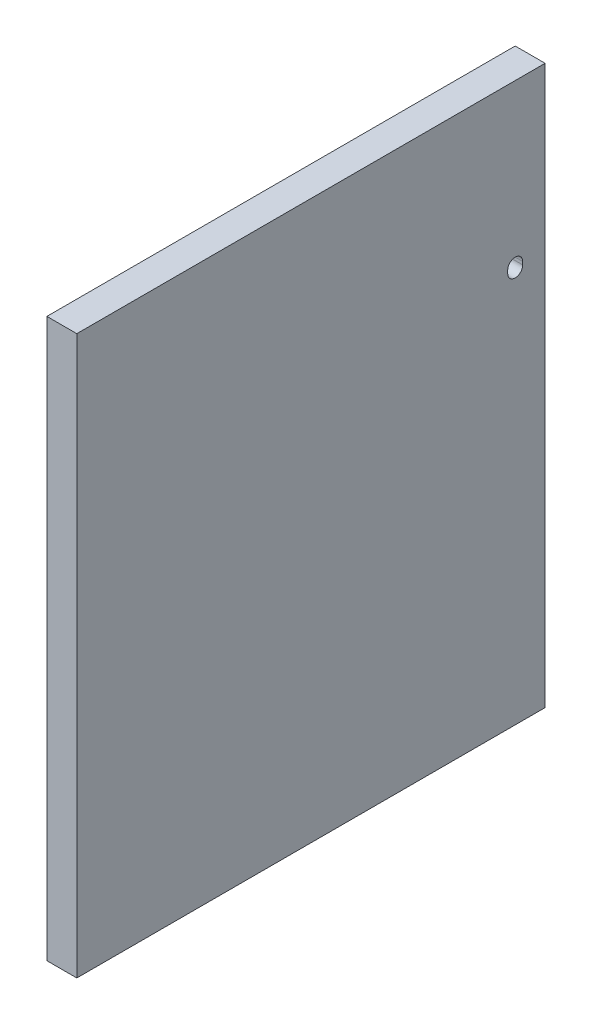
ISO-10303-21;
HEADER;
FILE_DESCRIPTION(('STEP AP214'),'2;1');
FILE_NAME('part.step','',(''),(''),'','','');
FILE_SCHEMA(('AUTOMOTIVE_DESIGN { 1 0 10303 214 1 1 1 1 }'));
ENDSEC;
DATA;
#1=APPLICATION_CONTEXT('core data for automotive mechanical design processes');
#2=APPLICATION_PROTOCOL_DEFINITION('international standard','automotive_design',2000,#1);
#3=PRODUCT_CONTEXT('',#1,'mechanical');
#4=PRODUCT('Part','Part','',(#3));
#5=PRODUCT_RELATED_PRODUCT_CATEGORY('part','',(#4));
#6=PRODUCT_DEFINITION_FORMATION('','',#4);
#7=PRODUCT_DEFINITION_CONTEXT('part definition',#1,'design');
#8=PRODUCT_DEFINITION('design','',#6,#7);
#9=PRODUCT_DEFINITION_SHAPE('','',#8);
#10=(LENGTH_UNIT() NAMED_UNIT(*) SI_UNIT(.MILLI.,.METRE.));
#11=(NAMED_UNIT(*) PLANE_ANGLE_UNIT() SI_UNIT($,.RADIAN.));
#12=(NAMED_UNIT(*) SI_UNIT($,.STERADIAN.) SOLID_ANGLE_UNIT());
#13=UNCERTAINTY_MEASURE_WITH_UNIT(LENGTH_MEASURE(1.E-05),#10,'distance_accuracy_value','');
#14=(GEOMETRIC_REPRESENTATION_CONTEXT(3) GLOBAL_UNCERTAINTY_ASSIGNED_CONTEXT((#13)) GLOBAL_UNIT_ASSIGNED_CONTEXT((#10,
#11,#12)) REPRESENTATION_CONTEXT('',''));
#15=CARTESIAN_POINT('',(0.,0.,0.));
#16=DIRECTION('',(0.,0.,1.));
#17=DIRECTION('',(1.,0.,0.));
#18=AXIS2_PLACEMENT_3D('',#15,#16,#17);
#19=CARTESIAN_POINT('',(12.7,68.7232885793492,-49.1565136701883));
#20=DIRECTION('',(0.,0.,1.));
#21=DIRECTION('',(0.,-1.,0.));
#22=AXIS2_PLACEMENT_3D('',#19,#20,#21);
#23=PLANE('',#22);
#24=DIRECTION('',(0.,1.,0.));
#25=VECTOR('',#24,1.);
#26=CARTESIAN_POINT('',(0.,68.7232885793492,-49.1565136701883));
#27=LINE('',#26,#25);
#28=CARTESIAN_POINT('',(0.,-168.110077071333,-49.1565136701883));
#29=VERTEX_POINT('',#28);
#30=CARTESIAN_POINT('',(0.,68.7232885793492,-49.1565136701883));
#31=VERTEX_POINT('',#30);
#32=EDGE_CURVE('E143',#29,#31,#27,.T.);
#33=ORIENTED_EDGE('',*,*,#32,.T.);
#34=DIRECTION('',(-1.,0.,0.));
#35=VECTOR('',#34,1.);
#36=CARTESIAN_POINT('',(12.7,68.7232885793492,-49.1565136701883));
#37=LINE('',#36,#35);
#38=CARTESIAN_POINT('',(12.7,68.7232885793492,-49.1565136701883));
#39=VERTEX_POINT('',#38);
#40=EDGE_CURVE('E174',#39,#31,#37,.T.);
#41=ORIENTED_EDGE('',*,*,#40,.F.);
#42=DIRECTION('',(0.,1.,0.));
#43=VECTOR('',#42,1.);
#44=CARTESIAN_POINT('',(12.7,68.7232885793492,-49.1565136701883));
#45=LINE('',#44,#43);
#46=CARTESIAN_POINT('',(12.7,-168.110077071333,-49.1565136701883));
#47=VERTEX_POINT('',#46);
#48=EDGE_CURVE('E148',#47,#39,#45,.T.);
#49=ORIENTED_EDGE('',*,*,#48,.F.);
#50=DIRECTION('',(-1.,0.,0.));
#51=VECTOR('',#50,1.);
#52=CARTESIAN_POINT('',(12.7,-168.110077071333,-49.1565136701883));
#53=LINE('',#52,#51);
#54=EDGE_CURVE('E158',#47,#29,#53,.T.);
#55=ORIENTED_EDGE('',*,*,#54,.T.);
#56=EDGE_LOOP('',(#33,#41,#49,#55));
#57=FACE_BOUND('',#56,.T.);
#58=ADVANCED_FACE('F40',(#57),#23,.F.);
#59=CARTESIAN_POINT('',(12.7,68.7232885793492,149.604495714321));
#60=DIRECTION('',(0.,-1.,0.));
#61=DIRECTION('',(0.,0.,-1.));
#62=AXIS2_PLACEMENT_3D('',#59,#60,#61);
#63=PLANE('',#62);
#64=DIRECTION('',(0.,0.,1.));
#65=VECTOR('',#64,1.);
#66=CARTESIAN_POINT('',(0.,68.7232885793492,149.604495714321));
#67=LINE('',#66,#65);
#68=CARTESIAN_POINT('',(0.,68.7232885793492,149.604495714321));
#69=VERTEX_POINT('',#68);
#70=EDGE_CURVE('E161',#31,#69,#67,.T.);
#71=ORIENTED_EDGE('',*,*,#70,.T.);
#72=DIRECTION('',(-1.,0.,0.));
#73=VECTOR('',#72,1.);
#74=CARTESIAN_POINT('',(12.7,68.7232885793492,149.604495714321));
#75=LINE('',#74,#73);
#76=CARTESIAN_POINT('',(12.7,68.7232885793492,149.604495714321));
#77=VERTEX_POINT('',#76);
#78=EDGE_CURVE('E171',#77,#69,#75,.T.);
#79=ORIENTED_EDGE('',*,*,#78,.F.);
#80=DIRECTION('',(0.,0.,1.));
#81=VECTOR('',#80,1.);
#82=CARTESIAN_POINT('',(12.7,68.7232885793492,149.604495714321));
#83=LINE('',#82,#81);
#84=EDGE_CURVE('E151',#39,#77,#83,.T.);
#85=ORIENTED_EDGE('',*,*,#84,.F.);
#86=ORIENTED_EDGE('',*,*,#40,.T.);
#87=EDGE_LOOP('',(#71,#79,#85,#86));
#88=FACE_BOUND('',#87,.T.);
#89=ADVANCED_FACE('F238',(#88),#63,.F.);
#90=CARTESIAN_POINT('',(12.7,68.7232885793492,149.604495714321));
#91=DIRECTION('',(0.,0.,-1.));
#92=DIRECTION('',(0.,1.,0.));
#93=AXIS2_PLACEMENT_3D('',#90,#91,#92);
#94=PLANE('',#93);
#95=DIRECTION('',(0.,-1.,0.));
#96=VECTOR('',#95,1.);
#97=CARTESIAN_POINT('',(0.,68.7232885793492,149.604495714321));
#98=LINE('',#97,#96);
#99=CARTESIAN_POINT('',(0.,-168.110077071333,149.604495714321));
#100=VERTEX_POINT('',#99);
#101=EDGE_CURVE('E163',#69,#100,#98,.T.);
#102=ORIENTED_EDGE('',*,*,#101,.T.);
#103=DIRECTION('',(-1.,0.,0.));
#104=VECTOR('',#103,1.);
#105=CARTESIAN_POINT('',(12.7,-168.110077071333,149.604495714321));
#106=LINE('',#105,#104);
#107=CARTESIAN_POINT('',(12.7,-168.110077071333,149.604495714321));
#108=VERTEX_POINT('',#107);
#109=EDGE_CURVE('E168',#108,#100,#106,.T.);
#110=ORIENTED_EDGE('',*,*,#109,.F.);
#111=DIRECTION('',(0.,-1.,0.));
#112=VECTOR('',#111,1.);
#113=CARTESIAN_POINT('',(12.7,68.7232885793492,149.604495714321));
#114=LINE('',#113,#112);
#115=EDGE_CURVE('E154',#77,#108,#114,.T.);
#116=ORIENTED_EDGE('',*,*,#115,.F.);
#117=ORIENTED_EDGE('',*,*,#78,.T.);
#118=EDGE_LOOP('',(#102,#110,#116,#117));
#119=FACE_BOUND('',#118,.T.);
#120=ADVANCED_FACE('F235',(#119),#94,.F.);
#121=CARTESIAN_POINT('',(12.7,-168.110077071333,149.604495714321));
#122=DIRECTION('',(0.,1.,0.));
#123=DIRECTION('',(0.,0.,1.));
#124=AXIS2_PLACEMENT_3D('',#121,#122,#123);
#125=PLANE('',#124);
#126=DIRECTION('',(0.,0.,-1.));
#127=VECTOR('',#126,1.);
#128=CARTESIAN_POINT('',(0.,-168.110077071333,149.604495714321));
#129=LINE('',#128,#127);
#130=EDGE_CURVE('E152',#100,#29,#129,.T.);
#131=ORIENTED_EDGE('',*,*,#130,.T.);
#132=ORIENTED_EDGE('',*,*,#54,.F.);
#133=DIRECTION('',(0.,0.,-1.));
#134=VECTOR('',#133,1.);
#135=CARTESIAN_POINT('',(12.7,-168.110077071333,149.604495714321));
#136=LINE('',#135,#134);
#137=EDGE_CURVE('E156',#108,#47,#136,.T.);
#138=ORIENTED_EDGE('',*,*,#137,.F.);
#139=ORIENTED_EDGE('',*,*,#109,.T.);
#140=EDGE_LOOP('',(#131,#132,#138,#139));
#141=FACE_BOUND('',#140,.T.);
#142=ADVANCED_FACE('F231',(#141),#125,.F.);
#143=CARTESIAN_POINT('',(12.7,0.,0.));
#144=DIRECTION('',(1.,0.,0.));
#145=DIRECTION('',(0.,0.,-1.));
#146=AXIS2_PLACEMENT_3D('',#143,#144,#145);
#147=PLANE('',#146);
#148=CARTESIAN_POINT('',(12.7,0.635000000000001,-36.4565136701883));
#149=DIRECTION('',(-1.,0.,0.));
#150=DIRECTION('',(0.,0.,1.));
#151=AXIS2_PLACEMENT_3D('',#148,#149,#150);
#152=CIRCLE('',#151,3.17500000000001);
#153=CARTESIAN_POINT('',(12.7,0.635000000000002,-33.2815136701883));
#154=VERTEX_POINT('',#153);
#155=CARTESIAN_POINT('',(12.7,0.635000000000002,-39.6315136701883));
#156=VERTEX_POINT('',#155);
#157=EDGE_CURVE('E120',#154,#156,#152,.T.);
#158=ORIENTED_EDGE('',*,*,#157,.T.);
#159=DIRECTION('',(0.,-1.,0.));
#160=VECTOR('',#159,1.);
#161=CARTESIAN_POINT('',(12.7,0.635000000000002,-39.6315136701883));
#162=LINE('',#161,#160);
#163=CARTESIAN_POINT('',(12.7,-0.635000000000001,-39.6315136701883));
#164=VERTEX_POINT('',#163);
#165=EDGE_CURVE('E126',#156,#164,#162,.T.);
#166=ORIENTED_EDGE('',*,*,#165,.T.);
#167=CARTESIAN_POINT('',(12.7,-0.635000000000001,-36.4565136701883));
#168=DIRECTION('',(-1.,0.,0.));
#169=DIRECTION('',(0.,0.,1.));
#170=AXIS2_PLACEMENT_3D('',#167,#168,#169);
#171=CIRCLE('',#170,3.17500000000001);
#172=CARTESIAN_POINT('',(12.7,-0.635000000000002,-33.2815136701883));
#173=VERTEX_POINT('',#172);
#174=EDGE_CURVE('E130',#164,#173,#171,.T.);
#175=ORIENTED_EDGE('',*,*,#174,.T.);
#176=DIRECTION('',(0.,1.,0.));
#177=VECTOR('',#176,1.);
#178=CARTESIAN_POINT('',(12.7,0.635000000000002,-33.2815136701883));
#179=LINE('',#178,#177);
#180=EDGE_CURVE('E123',#173,#154,#179,.T.);
#181=ORIENTED_EDGE('',*,*,#180,.T.);
#182=EDGE_LOOP('',(#158,#166,#175,#181));
#183=FACE_BOUND('',#182,.T.);
#184=ORIENTED_EDGE('',*,*,#48,.T.);
#185=ORIENTED_EDGE('',*,*,#84,.T.);
#186=ORIENTED_EDGE('',*,*,#115,.T.);
#187=ORIENTED_EDGE('',*,*,#137,.T.);
#188=EDGE_LOOP('',(#184,#185,#186,#187));
#189=FACE_BOUND('',#188,.T.);
#190=ADVANCED_FACE('F132',(#183,#189),#147,.T.);
#191=CARTESIAN_POINT('',(0.,0.,0.));
#192=DIRECTION('',(1.,0.,0.));
#193=DIRECTION('',(0.,0.,-1.));
#194=AXIS2_PLACEMENT_3D('',#191,#192,#193);
#195=PLANE('',#194);
#196=CARTESIAN_POINT('',(0.,0.635000000000001,-36.4565136701883));
#197=DIRECTION('',(1.,0.,0.));
#198=DIRECTION('',(0.,0.,-1.));
#199=AXIS2_PLACEMENT_3D('',#196,#197,#198);
#200=CIRCLE('',#199,6.17500000000001);
#201=CARTESIAN_POINT('',(0.,0.635000000000002,-42.6315136701883));
#202=VERTEX_POINT('',#201);
#203=CARTESIAN_POINT('',(0.,0.635000000000002,-30.2815136701883));
#204=VERTEX_POINT('',#203);
#205=EDGE_CURVE('E180',#202,#204,#200,.T.);
#206=ORIENTED_EDGE('',*,*,#205,.T.);
#207=DIRECTION('',(0.,1.,0.));
#208=VECTOR('',#207,1.);
#209=CARTESIAN_POINT('',(0.,0.,-30.2815136701883));
#210=LINE('',#209,#208);
#211=CARTESIAN_POINT('',(0.,-0.635000000000002,-30.2815136701883));
#212=VERTEX_POINT('',#211);
#213=EDGE_CURVE('E186',#204,#212,#210,.F.);
#214=ORIENTED_EDGE('',*,*,#213,.T.);
#215=CARTESIAN_POINT('',(0.,-0.635000000000001,-36.4565136701883));
#216=DIRECTION('',(1.,0.,0.));
#217=DIRECTION('',(0.,0.,-1.));
#218=AXIS2_PLACEMENT_3D('',#215,#216,#217);
#219=CIRCLE('',#218,6.17500000000001);
#220=CARTESIAN_POINT('',(0.,-0.635,-42.6315136701883));
#221=VERTEX_POINT('',#220);
#222=EDGE_CURVE('E184',#212,#221,#219,.T.);
#223=ORIENTED_EDGE('',*,*,#222,.T.);
#224=DIRECTION('',(0.,-1.,0.));
#225=VECTOR('',#224,1.);
#226=CARTESIAN_POINT('',(0.,0.,-42.6315136701883));
#227=LINE('',#226,#225);
#228=EDGE_CURVE('E182',#221,#202,#227,.F.);
#229=ORIENTED_EDGE('',*,*,#228,.T.);
#230=EDGE_LOOP('',(#206,#214,#223,#229));
#231=FACE_BOUND('',#230,.T.);
#232=ORIENTED_EDGE('',*,*,#32,.F.);
#233=ORIENTED_EDGE('',*,*,#130,.F.);
#234=ORIENTED_EDGE('',*,*,#101,.F.);
#235=ORIENTED_EDGE('',*,*,#70,.F.);
#236=EDGE_LOOP('',(#232,#233,#234,#235));
#237=FACE_BOUND('',#236,.T.);
#238=ADVANCED_FACE('F218',(#231,#237),#195,.F.);
#239=CARTESIAN_POINT('',(12.7,0.635000000000001,-36.4565136701883));
#240=DIRECTION('',(-1.,0.,0.));
#241=DIRECTION('',(0.,0.,1.));
#242=AXIS2_PLACEMENT_3D('',#239,#240,#241);
#243=CYLINDRICAL_SURFACE('',#242,3.17500000000001);
#244=DIRECTION('',(-1.,0.,0.));
#245=VECTOR('',#244,1.);
#246=CARTESIAN_POINT('',(12.7,0.635000000000002,-33.2815136701883));
#247=LINE('',#246,#245);
#248=CARTESIAN_POINT('',(3.00000000000001,0.635000000000002,-33.2815136701883));
#249=VERTEX_POINT('',#248);
#250=EDGE_CURVE('E141',#154,#249,#247,.T.);
#251=ORIENTED_EDGE('',*,*,#250,.T.);
#252=CARTESIAN_POINT('',(3.,0.635000000000001,-36.4565136701883));
#253=DIRECTION('',(1.,0.,0.));
#254=DIRECTION('',(0.,0.,-1.));
#255=AXIS2_PLACEMENT_3D('',#252,#253,#254);
#256=CIRCLE('',#255,3.17500000000001);
#257=CARTESIAN_POINT('',(3.00000000000001,0.635000000000002,-39.6315136701883));
#258=VERTEX_POINT('',#257);
#259=EDGE_CURVE('E11',#249,#258,#256,.F.);
#260=ORIENTED_EDGE('',*,*,#259,.T.);
#261=DIRECTION('',(-1.,0.,0.));
#262=VECTOR('',#261,1.);
#263=CARTESIAN_POINT('',(12.7,0.635000000000002,-39.6315136701883));
#264=LINE('',#263,#262);
#265=EDGE_CURVE('E116',#156,#258,#264,.T.);
#266=ORIENTED_EDGE('',*,*,#265,.F.);
#267=ORIENTED_EDGE('',*,*,#157,.F.);
#268=EDGE_LOOP('',(#251,#260,#266,#267));
#269=FACE_BOUND('',#268,.T.);
#270=ADVANCED_FACE('F118',(#269),#243,.F.);
#271=CARTESIAN_POINT('',(12.7,0.635000000000002,-33.2815136701883));
#272=DIRECTION('',(0.,0.,1.));
#273=DIRECTION('',(1.,0.,0.));
#274=AXIS2_PLACEMENT_3D('',#271,#272,#273);
#275=PLANE('',#274);
#276=DIRECTION('',(-1.,0.,0.));
#277=VECTOR('',#276,1.);
#278=CARTESIAN_POINT('',(12.7,-0.635000000000002,-33.2815136701883));
#279=LINE('',#278,#277);
#280=CARTESIAN_POINT('',(3.00000000000001,-0.635000000000002,-33.2815136701883));
#281=VERTEX_POINT('',#280);
#282=EDGE_CURVE('E144',#173,#281,#279,.T.);
#283=ORIENTED_EDGE('',*,*,#282,.T.);
#284=DIRECTION('',(0.,1.,0.));
#285=VECTOR('',#284,1.);
#286=CARTESIAN_POINT('',(3.,0.635000000000002,-33.2815136701883));
#287=LINE('',#286,#285);
#288=EDGE_CURVE('E177',#281,#249,#287,.T.);
#289=ORIENTED_EDGE('',*,*,#288,.T.);
#290=ORIENTED_EDGE('',*,*,#250,.F.);
#291=ORIENTED_EDGE('',*,*,#180,.F.);
#292=EDGE_LOOP('',(#283,#289,#290,#291));
#293=FACE_BOUND('',#292,.T.);
#294=ADVANCED_FACE('F213',(#293),#275,.F.);
#295=CARTESIAN_POINT('',(12.7,-0.635000000000001,-36.4565136701883));
#296=DIRECTION('',(-1.,0.,0.));
#297=DIRECTION('',(0.,0.,1.));
#298=AXIS2_PLACEMENT_3D('',#295,#296,#297);
#299=CYLINDRICAL_SURFACE('',#298,3.17500000000001);
#300=DIRECTION('',(-1.,0.,0.));
#301=VECTOR('',#300,1.);
#302=CARTESIAN_POINT('',(12.7,-0.635000000000001,-39.6315136701883));
#303=LINE('',#302,#301);
#304=CARTESIAN_POINT('',(3.,-0.635000000000001,-39.6315136701883));
#305=VERTEX_POINT('',#304);
#306=EDGE_CURVE('E122',#164,#305,#303,.T.);
#307=ORIENTED_EDGE('',*,*,#306,.T.);
#308=CARTESIAN_POINT('',(3.,-0.635000000000001,-36.4565136701883));
#309=DIRECTION('',(1.,0.,0.));
#310=DIRECTION('',(0.,0.,-1.));
#311=AXIS2_PLACEMENT_3D('',#308,#309,#310);
#312=CIRCLE('',#311,3.17500000000001);
#313=EDGE_CURVE('E189',#305,#281,#312,.F.);
#314=ORIENTED_EDGE('',*,*,#313,.T.);
#315=ORIENTED_EDGE('',*,*,#282,.F.);
#316=ORIENTED_EDGE('',*,*,#174,.F.);
#317=EDGE_LOOP('',(#307,#314,#315,#316));
#318=FACE_BOUND('',#317,.T.);
#319=ADVANCED_FACE('F211',(#318),#299,.F.);
#320=CARTESIAN_POINT('',(12.7,0.635000000000002,-39.6315136701883));
#321=DIRECTION('',(0.,0.,-1.));
#322=DIRECTION('',(-1.,0.,0.));
#323=AXIS2_PLACEMENT_3D('',#320,#321,#322);
#324=PLANE('',#323);
#325=ORIENTED_EDGE('',*,*,#265,.T.);
#326=DIRECTION('',(0.,-1.,0.));
#327=VECTOR('',#326,1.);
#328=CARTESIAN_POINT('',(3.,0.635000000000002,-39.6315136701883));
#329=LINE('',#328,#327);
#330=EDGE_CURVE('E49',#258,#305,#329,.T.);
#331=ORIENTED_EDGE('',*,*,#330,.T.);
#332=ORIENTED_EDGE('',*,*,#306,.F.);
#333=ORIENTED_EDGE('',*,*,#165,.F.);
#334=EDGE_LOOP('',(#325,#331,#332,#333));
#335=FACE_BOUND('',#334,.T.);
#336=ADVANCED_FACE('F127',(#335),#324,.F.);
#337=CARTESIAN_POINT('',(3.,0.635000000000002,-42.6315136701883));
#338=DIRECTION('',(0.,-1.,0.));
#339=DIRECTION('',(0.,0.,-1.));
#340=AXIS2_PLACEMENT_3D('',#337,#338,#339);
#341=CYLINDRICAL_SURFACE('',#340,3.);
#342=CARTESIAN_POINT('',(3.,0.635000000000002,-42.6315136701883));
#343=DIRECTION('',(0.,1.,0.));
#344=DIRECTION('',(0.,0.,1.));
#345=AXIS2_PLACEMENT_3D('',#342,#343,#344);
#346=CIRCLE('',#345,3.);
#347=EDGE_CURVE('E137',#202,#258,#346,.T.);
#348=ORIENTED_EDGE('',*,*,#347,.F.);
#349=ORIENTED_EDGE('',*,*,#228,.F.);
#350=CARTESIAN_POINT('',(3.,-0.635000000000001,-42.6315136701883));
#351=DIRECTION('',(0.,-1.,0.));
#352=DIRECTION('',(1.,0.,0.));
#353=AXIS2_PLACEMENT_3D('',#350,#351,#352);
#354=CIRCLE('',#353,3.);
#355=EDGE_CURVE('E44',#305,#221,#354,.T.);
#356=ORIENTED_EDGE('',*,*,#355,.F.);
#357=ORIENTED_EDGE('',*,*,#330,.F.);
#358=EDGE_LOOP('',(#348,#349,#356,#357));
#359=FACE_BOUND('',#358,.T.);
#360=ADVANCED_FACE('F42',(#359),#341,.T.);
#361=CARTESIAN_POINT('',(3.,-0.635000000000001,-36.4565136701883));
#362=DIRECTION('',(1.,0.,0.));
#363=DIRECTION('',(0.,0.,-1.));
#364=AXIS2_PLACEMENT_3D('',#361,#362,#363);
#365=TOROIDAL_SURFACE('',#364,6.17500000000001,3.);
#366=ORIENTED_EDGE('',*,*,#355,.T.);
#367=ORIENTED_EDGE('',*,*,#222,.F.);
#368=CARTESIAN_POINT('',(3.,-0.635000000000004,-30.2815136701883));
#369=DIRECTION('',(0.,1.,0.));
#370=DIRECTION('',(0.,0.,1.));
#371=AXIS2_PLACEMENT_3D('',#368,#369,#370);
#372=CIRCLE('',#371,3.);
#373=EDGE_CURVE('E194',#281,#212,#372,.T.);
#374=ORIENTED_EDGE('',*,*,#373,.F.);
#375=ORIENTED_EDGE('',*,*,#313,.F.);
#376=EDGE_LOOP('',(#366,#367,#374,#375));
#377=FACE_BOUND('',#376,.T.);
#378=ADVANCED_FACE('F208',(#377),#365,.T.);
#379=CARTESIAN_POINT('',(3.,0.635000000000001,-36.4565136701883));
#380=DIRECTION('',(1.,0.,0.));
#381=DIRECTION('',(0.,0.,-1.));
#382=AXIS2_PLACEMENT_3D('',#379,#380,#381);
#383=TOROIDAL_SURFACE('',#382,6.17500000000001,3.);
#384=ORIENTED_EDGE('',*,*,#347,.T.);
#385=ORIENTED_EDGE('',*,*,#259,.F.);
#386=CARTESIAN_POINT('',(3.,0.635000000000002,-30.2815136701883));
#387=DIRECTION('',(0.,-1.,0.));
#388=DIRECTION('',(0.,0.,-1.));
#389=AXIS2_PLACEMENT_3D('',#386,#387,#388);
#390=CIRCLE('',#389,3.);
#391=EDGE_CURVE('E192',#204,#249,#390,.T.);
#392=ORIENTED_EDGE('',*,*,#391,.F.);
#393=ORIENTED_EDGE('',*,*,#205,.F.);
#394=EDGE_LOOP('',(#384,#385,#392,#393));
#395=FACE_BOUND('',#394,.T.);
#396=ADVANCED_FACE('F199',(#395),#383,.T.);
#397=CARTESIAN_POINT('',(3.,0.635000000000002,-30.2815136701883));
#398=DIRECTION('',(0.,1.,0.));
#399=DIRECTION('',(0.,0.,1.));
#400=AXIS2_PLACEMENT_3D('',#397,#398,#399);
#401=CYLINDRICAL_SURFACE('',#400,3.);
#402=ORIENTED_EDGE('',*,*,#373,.T.);
#403=ORIENTED_EDGE('',*,*,#213,.F.);
#404=ORIENTED_EDGE('',*,*,#391,.T.);
#405=ORIENTED_EDGE('',*,*,#288,.F.);
#406=EDGE_LOOP('',(#402,#403,#404,#405));
#407=FACE_BOUND('',#406,.T.);
#408=ADVANCED_FACE('F215',(#407),#401,.T.);
#409=CLOSED_SHELL('',(#58,#89,#120,#142,#190,#238,#270,#294,#319,#336,#360,#378,#396,#408));
#410=MANIFOLD_SOLID_BREP('B2',#409);
#411=ADVANCED_BREP_SHAPE_REPRESENTATION('',(#18,#410),#14);
#412=SHAPE_DEFINITION_REPRESENTATION(#9,#411);
ENDSEC;
END-ISO-10303-21;
